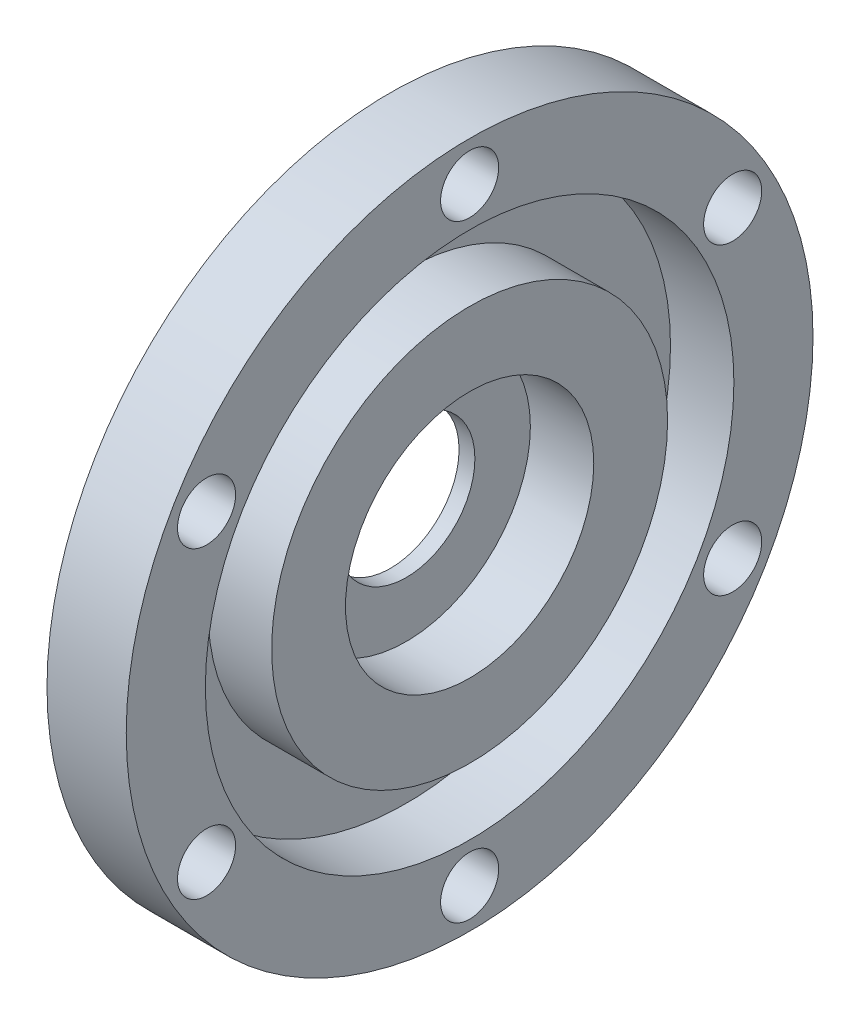
ISO-10303-21;
HEADER;
FILE_DESCRIPTION(('STEP AP214'),'2;1');
FILE_NAME('part.step','',(''),(''),'','','');
FILE_SCHEMA(('AUTOMOTIVE_DESIGN { 1 0 10303 214 1 1 1 1 }'));
ENDSEC;
DATA;
#1=APPLICATION_CONTEXT('core data for automotive mechanical design processes');
#2=APPLICATION_PROTOCOL_DEFINITION('international standard','automotive_design',2000,#1);
#3=PRODUCT_CONTEXT('',#1,'mechanical');
#4=PRODUCT('Part','Part','',(#3));
#5=PRODUCT_RELATED_PRODUCT_CATEGORY('part','',(#4));
#6=PRODUCT_DEFINITION_FORMATION('','',#4);
#7=PRODUCT_DEFINITION_CONTEXT('part definition',#1,'design');
#8=PRODUCT_DEFINITION('design','',#6,#7);
#9=PRODUCT_DEFINITION_SHAPE('','',#8);
#10=(LENGTH_UNIT() NAMED_UNIT(*) SI_UNIT(.MILLI.,.METRE.));
#11=(NAMED_UNIT(*) PLANE_ANGLE_UNIT() SI_UNIT($,.RADIAN.));
#12=(NAMED_UNIT(*) SI_UNIT($,.STERADIAN.) SOLID_ANGLE_UNIT());
#13=UNCERTAINTY_MEASURE_WITH_UNIT(LENGTH_MEASURE(1.E-05),#10,'distance_accuracy_value','');
#14=(GEOMETRIC_REPRESENTATION_CONTEXT(3) GLOBAL_UNCERTAINTY_ASSIGNED_CONTEXT((#13)) GLOBAL_UNIT_ASSIGNED_CONTEXT((#10,
#11,#12)) REPRESENTATION_CONTEXT('',''));
#15=CARTESIAN_POINT('',(0.,0.,0.));
#16=DIRECTION('',(0.,0.,1.));
#17=DIRECTION('',(1.,0.,0.));
#18=AXIS2_PLACEMENT_3D('',#15,#16,#17);
#19=CARTESIAN_POINT('',(3.,57.5,0.));
#20=DIRECTION('',(-1.,0.,0.));
#21=DIRECTION('',(0.,0.,1.));
#22=AXIS2_PLACEMENT_3D('',#19,#20,#21);
#23=CYLINDRICAL_SURFACE('',#22,2.5);
#24=CARTESIAN_POINT('',(0.,57.5,0.));
#25=DIRECTION('',(1.,0.,0.));
#26=DIRECTION('',(0.,0.,-1.));
#27=AXIS2_PLACEMENT_3D('',#24,#25,#26);
#28=CIRCLE('',#27,2.5);
#29=CARTESIAN_POINT('',(0.,57.5,-2.5));
#30=VERTEX_POINT('',#29);
#31=EDGE_CURVE('E87',#30,#30,#28,.T.);
#32=ORIENTED_EDGE('',*,*,#31,.F.);
#33=EDGE_LOOP('',(#32));
#34=FACE_BOUND('',#33,.T.);
#35=CARTESIAN_POINT('',(7.,57.5,0.));
#36=DIRECTION('',(1.,0.,0.));
#37=DIRECTION('',(0.,0.,-1.));
#38=AXIS2_PLACEMENT_3D('',#35,#36,#37);
#39=CIRCLE('',#38,2.5);
#40=CARTESIAN_POINT('',(7.,57.5,-2.5));
#41=VERTEX_POINT('',#40);
#42=EDGE_CURVE('E45',#41,#41,#39,.T.);
#43=ORIENTED_EDGE('',*,*,#42,.T.);
#44=EDGE_LOOP('',(#43));
#45=FACE_BOUND('',#44,.T.);
#46=ADVANCED_FACE('F41',(#34,#45),#23,.F.);
#47=CARTESIAN_POINT('',(3.,28.75,-49.7964607176052));
#48=DIRECTION('',(-1.,0.,0.));
#49=DIRECTION('',(0.,0.,1.));
#50=AXIS2_PLACEMENT_3D('',#47,#48,#49);
#51=CYLINDRICAL_SURFACE('',#50,2.50000000000001);
#52=CARTESIAN_POINT('',(0.,28.75,-49.7964607176052));
#53=DIRECTION('',(1.,0.,0.));
#54=DIRECTION('',(0.,0.,-1.));
#55=AXIS2_PLACEMENT_3D('',#52,#53,#54);
#56=CIRCLE('',#55,2.50000000000001);
#57=CARTESIAN_POINT('',(0.,28.75,-52.2964607176052));
#58=VERTEX_POINT('',#57);
#59=EDGE_CURVE('E84',#58,#58,#56,.T.);
#60=ORIENTED_EDGE('',*,*,#59,.F.);
#61=EDGE_LOOP('',(#60));
#62=FACE_BOUND('',#61,.T.);
#63=CARTESIAN_POINT('',(7.,28.75,-49.7964607176052));
#64=DIRECTION('',(1.,0.,0.));
#65=DIRECTION('',(0.,0.,-1.));
#66=AXIS2_PLACEMENT_3D('',#63,#64,#65);
#67=CIRCLE('',#66,2.50000000000001);
#68=CARTESIAN_POINT('',(7.,28.75,-52.2964607176052));
#69=VERTEX_POINT('',#68);
#70=EDGE_CURVE('E107',#69,#69,#67,.T.);
#71=ORIENTED_EDGE('',*,*,#70,.T.);
#72=EDGE_LOOP('',(#71));
#73=FACE_BOUND('',#72,.T.);
#74=ADVANCED_FACE('F201',(#62,#73),#51,.F.);
#75=CARTESIAN_POINT('',(3.,-28.75,-49.7964607176052));
#76=DIRECTION('',(-1.,0.,0.));
#77=DIRECTION('',(0.,0.,1.));
#78=AXIS2_PLACEMENT_3D('',#75,#76,#77);
#79=CYLINDRICAL_SURFACE('',#78,2.5);
#80=CARTESIAN_POINT('',(0.,-28.75,-49.7964607176052));
#81=DIRECTION('',(1.,0.,0.));
#82=DIRECTION('',(0.,0.,-1.));
#83=AXIS2_PLACEMENT_3D('',#80,#81,#82);
#84=CIRCLE('',#83,2.5);
#85=CARTESIAN_POINT('',(0.,-28.75,-52.2964607176052));
#86=VERTEX_POINT('',#85);
#87=EDGE_CURVE('E81',#86,#86,#84,.T.);
#88=ORIENTED_EDGE('',*,*,#87,.F.);
#89=EDGE_LOOP('',(#88));
#90=FACE_BOUND('',#89,.T.);
#91=CARTESIAN_POINT('',(7.,-28.75,-49.7964607176052));
#92=DIRECTION('',(1.,0.,0.));
#93=DIRECTION('',(0.,0.,-1.));
#94=AXIS2_PLACEMENT_3D('',#91,#92,#93);
#95=CIRCLE('',#94,2.5);
#96=CARTESIAN_POINT('',(7.,-28.75,-52.2964607176052));
#97=VERTEX_POINT('',#96);
#98=EDGE_CURVE('E105',#97,#97,#95,.T.);
#99=ORIENTED_EDGE('',*,*,#98,.T.);
#100=EDGE_LOOP('',(#99));
#101=FACE_BOUND('',#100,.T.);
#102=ADVANCED_FACE('F206',(#90,#101),#79,.F.);
#103=CARTESIAN_POINT('',(3.,-57.5,0.));
#104=DIRECTION('',(-1.,0.,0.));
#105=DIRECTION('',(0.,0.,1.));
#106=AXIS2_PLACEMENT_3D('',#103,#104,#105);
#107=CYLINDRICAL_SURFACE('',#106,2.5);
#108=CARTESIAN_POINT('',(0.,-57.5,0.));
#109=DIRECTION('',(1.,0.,0.));
#110=DIRECTION('',(0.,0.,-1.));
#111=AXIS2_PLACEMENT_3D('',#108,#109,#110);
#112=CIRCLE('',#111,2.5);
#113=CARTESIAN_POINT('',(0.,-57.5,-2.50000000000001));
#114=VERTEX_POINT('',#113);
#115=EDGE_CURVE('E78',#114,#114,#112,.T.);
#116=ORIENTED_EDGE('',*,*,#115,.F.);
#117=EDGE_LOOP('',(#116));
#118=FACE_BOUND('',#117,.T.);
#119=CARTESIAN_POINT('',(7.,-57.5,0.));
#120=DIRECTION('',(1.,0.,0.));
#121=DIRECTION('',(0.,0.,-1.));
#122=AXIS2_PLACEMENT_3D('',#119,#120,#121);
#123=CIRCLE('',#122,2.5);
#124=CARTESIAN_POINT('',(7.,-57.5,-2.50000000000001));
#125=VERTEX_POINT('',#124);
#126=EDGE_CURVE('E102',#125,#125,#123,.T.);
#127=ORIENTED_EDGE('',*,*,#126,.T.);
#128=EDGE_LOOP('',(#127));
#129=FACE_BOUND('',#128,.T.);
#130=ADVANCED_FACE('F213',(#118,#129),#107,.F.);
#131=CARTESIAN_POINT('',(3.,-28.75,49.7964607176052));
#132=DIRECTION('',(-1.,0.,0.));
#133=DIRECTION('',(0.,0.,1.));
#134=AXIS2_PLACEMENT_3D('',#131,#132,#133);
#135=CYLINDRICAL_SURFACE('',#134,2.5);
#136=CARTESIAN_POINT('',(0.,-28.75,49.7964607176052));
#137=DIRECTION('',(1.,0.,0.));
#138=DIRECTION('',(0.,0.,-1.));
#139=AXIS2_PLACEMENT_3D('',#136,#137,#138);
#140=CIRCLE('',#139,2.5);
#141=CARTESIAN_POINT('',(0.,-28.75,47.2964607176052));
#142=VERTEX_POINT('',#141);
#143=EDGE_CURVE('E75',#142,#142,#140,.T.);
#144=ORIENTED_EDGE('',*,*,#143,.F.);
#145=EDGE_LOOP('',(#144));
#146=FACE_BOUND('',#145,.T.);
#147=CARTESIAN_POINT('',(7.,-28.75,49.7964607176052));
#148=DIRECTION('',(1.,0.,0.));
#149=DIRECTION('',(0.,0.,-1.));
#150=AXIS2_PLACEMENT_3D('',#147,#148,#149);
#151=CIRCLE('',#150,2.5);
#152=CARTESIAN_POINT('',(7.,-28.75,47.2964607176052));
#153=VERTEX_POINT('',#152);
#154=EDGE_CURVE('E98',#153,#153,#151,.T.);
#155=ORIENTED_EDGE('',*,*,#154,.T.);
#156=EDGE_LOOP('',(#155));
#157=FACE_BOUND('',#156,.T.);
#158=ADVANCED_FACE('F216',(#146,#157),#135,.F.);
#159=CARTESIAN_POINT('',(3.,28.75,49.7964607176052));
#160=DIRECTION('',(-1.,0.,0.));
#161=DIRECTION('',(0.,0.,1.));
#162=AXIS2_PLACEMENT_3D('',#159,#160,#161);
#163=CYLINDRICAL_SURFACE('',#162,2.50000000000001);
#164=CARTESIAN_POINT('',(0.,28.75,49.7964607176052));
#165=DIRECTION('',(1.,0.,0.));
#166=DIRECTION('',(0.,0.,-1.));
#167=AXIS2_PLACEMENT_3D('',#164,#165,#166);
#168=CIRCLE('',#167,2.50000000000001);
#169=CARTESIAN_POINT('',(0.,28.75,47.2964607176052));
#170=VERTEX_POINT('',#169);
#171=EDGE_CURVE('E68',#170,#170,#168,.T.);
#172=ORIENTED_EDGE('',*,*,#171,.F.);
#173=EDGE_LOOP('',(#172));
#174=FACE_BOUND('',#173,.T.);
#175=CARTESIAN_POINT('',(7.,28.75,49.7964607176052));
#176=DIRECTION('',(1.,0.,0.));
#177=DIRECTION('',(0.,0.,-1.));
#178=AXIS2_PLACEMENT_3D('',#175,#176,#177);
#179=CIRCLE('',#178,2.50000000000001);
#180=CARTESIAN_POINT('',(7.,28.75,47.2964607176052));
#181=VERTEX_POINT('',#180);
#182=EDGE_CURVE('E95',#181,#181,#179,.T.);
#183=ORIENTED_EDGE('',*,*,#182,.T.);
#184=EDGE_LOOP('',(#183));
#185=FACE_BOUND('',#184,.T.);
#186=ADVANCED_FACE('F43',(#174,#185),#163,.F.);
#187=CARTESIAN_POINT('',(3.,0.,0.));
#188=DIRECTION('',(1.,0.,0.));
#189=DIRECTION('',(0.,0.,-1.));
#190=AXIS2_PLACEMENT_3D('',#187,#188,#189);
#191=PLANE('',#190);
#192=CARTESIAN_POINT('',(3.,0.,0.));
#193=DIRECTION('',(1.,0.,0.));
#194=DIRECTION('',(0.,0.,-1.));
#195=AXIS2_PLACEMENT_3D('',#192,#193,#194);
#196=CIRCLE('',#195,13.);
#197=CARTESIAN_POINT('',(3.,0.,-13.));
#198=VERTEX_POINT('',#197);
#199=EDGE_CURVE('E54',#198,#198,#196,.T.);
#200=ORIENTED_EDGE('',*,*,#199,.F.);
#201=EDGE_LOOP('',(#200));
#202=FACE_BOUND('',#201,.T.);
#203=CARTESIAN_POINT('',(3.,0.,0.));
#204=DIRECTION('',(1.,0.,0.));
#205=DIRECTION('',(0.,0.,-1.));
#206=AXIS2_PLACEMENT_3D('',#203,#204,#205);
#207=CIRCLE('',#206,23.5);
#208=CARTESIAN_POINT('',(3.,0.,-23.5));
#209=VERTEX_POINT('',#208);
#210=EDGE_CURVE('E49',#209,#209,#207,.F.);
#211=ORIENTED_EDGE('',*,*,#210,.F.);
#212=EDGE_LOOP('',(#211));
#213=FACE_BOUND('',#212,.T.);
#214=ADVANCED_FACE('F187',(#202,#213),#191,.T.);
#215=CARTESIAN_POINT('',(3.,0.,0.));
#216=DIRECTION('',(-1.,0.,0.));
#217=DIRECTION('',(0.,0.,1.));
#218=AXIS2_PLACEMENT_3D('',#215,#216,#217);
#219=CYLINDRICAL_SURFACE('',#218,65.);
#220=CARTESIAN_POINT('',(0.,0.,0.));
#221=DIRECTION('',(1.,0.,0.));
#222=DIRECTION('',(0.,0.,-1.));
#223=AXIS2_PLACEMENT_3D('',#220,#221,#222);
#224=CIRCLE('',#223,65.);
#225=CARTESIAN_POINT('',(0.,0.,-65.));
#226=VERTEX_POINT('',#225);
#227=EDGE_CURVE('E90',#226,#226,#224,.T.);
#228=ORIENTED_EDGE('',*,*,#227,.T.);
#229=EDGE_LOOP('',(#228));
#230=FACE_BOUND('',#229,.T.);
#231=CARTESIAN_POINT('',(15.,0.,0.));
#232=DIRECTION('',(1.,0.,0.));
#233=DIRECTION('',(0.,0.,-1.));
#234=AXIS2_PLACEMENT_3D('',#231,#232,#233);
#235=CIRCLE('',#234,65.);
#236=CARTESIAN_POINT('',(15.,0.,-65.));
#237=VERTEX_POINT('',#236);
#238=EDGE_CURVE('E58',#237,#237,#235,.T.);
#239=ORIENTED_EDGE('',*,*,#238,.F.);
#240=EDGE_LOOP('',(#239));
#241=FACE_BOUND('',#240,.T.);
#242=ADVANCED_FACE('F184',(#230,#241),#219,.T.);
#243=CARTESIAN_POINT('',(3.,0.,0.));
#244=DIRECTION('',(-1.,0.,0.));
#245=DIRECTION('',(0.,0.,1.));
#246=AXIS2_PLACEMENT_3D('',#243,#244,#245);
#247=CYLINDRICAL_SURFACE('',#246,13.);
#248=ORIENTED_EDGE('',*,*,#199,.T.);
#249=EDGE_LOOP('',(#248));
#250=FACE_BOUND('',#249,.T.);
#251=CARTESIAN_POINT('',(0.,0.,0.));
#252=DIRECTION('',(1.,0.,0.));
#253=DIRECTION('',(0.,0.,-1.));
#254=AXIS2_PLACEMENT_3D('',#251,#252,#253);
#255=CIRCLE('',#254,13.);
#256=CARTESIAN_POINT('',(0.,0.,-13.));
#257=VERTEX_POINT('',#256);
#258=EDGE_CURVE('E72',#257,#257,#255,.T.);
#259=ORIENTED_EDGE('',*,*,#258,.F.);
#260=EDGE_LOOP('',(#259));
#261=FACE_BOUND('',#260,.T.);
#262=ADVANCED_FACE('F186',(#250,#261),#247,.F.);
#263=CARTESIAN_POINT('',(3.,0.,0.));
#264=DIRECTION('',(1.,0.,0.));
#265=DIRECTION('',(0.,0.,-1.));
#266=AXIS2_PLACEMENT_3D('',#263,#264,#265);
#267=CIRCLE('',#266,50.025);
#268=CARTESIAN_POINT('',(3.,0.,-50.025));
#269=VERTEX_POINT('',#268);
#270=EDGE_CURVE('E11',#269,#269,#267,.F.);
#271=ORIENTED_EDGE('',*,*,#270,.F.);
#272=EDGE_LOOP('',(#271));
#273=FACE_BOUND('',#272,.T.);
#274=CARTESIAN_POINT('',(3.,0.,0.));
#275=DIRECTION('',(1.,0.,0.));
#276=DIRECTION('',(0.,0.,-1.));
#277=AXIS2_PLACEMENT_3D('',#274,#275,#276);
#278=CIRCLE('',#277,37.475);
#279=CARTESIAN_POINT('',(3.,0.,-37.475));
#280=VERTEX_POINT('',#279);
#281=EDGE_CURVE('E66',#280,#280,#278,.F.);
#282=ORIENTED_EDGE('',*,*,#281,.T.);
#283=EDGE_LOOP('',(#282));
#284=FACE_BOUND('',#283,.T.);
#285=ADVANCED_FACE('F194',(#273,#284),#191,.T.);
#286=CARTESIAN_POINT('',(0.,0.,0.));
#287=DIRECTION('',(1.,0.,0.));
#288=DIRECTION('',(0.,0.,-1.));
#289=AXIS2_PLACEMENT_3D('',#286,#287,#288);
#290=PLANE('',#289);
#291=ORIENTED_EDGE('',*,*,#258,.T.);
#292=EDGE_LOOP('',(#291));
#293=FACE_BOUND('',#292,.T.);
#294=ORIENTED_EDGE('',*,*,#227,.F.);
#295=EDGE_LOOP('',(#294));
#296=FACE_BOUND('',#295,.T.);
#297=ORIENTED_EDGE('',*,*,#31,.T.);
#298=EDGE_LOOP('',(#297));
#299=FACE_BOUND('',#298,.T.);
#300=ORIENTED_EDGE('',*,*,#59,.T.);
#301=EDGE_LOOP('',(#300));
#302=FACE_BOUND('',#301,.T.);
#303=ORIENTED_EDGE('',*,*,#87,.T.);
#304=EDGE_LOOP('',(#303));
#305=FACE_BOUND('',#304,.T.);
#306=ORIENTED_EDGE('',*,*,#115,.T.);
#307=EDGE_LOOP('',(#306));
#308=FACE_BOUND('',#307,.T.);
#309=ORIENTED_EDGE('',*,*,#143,.T.);
#310=EDGE_LOOP('',(#309));
#311=FACE_BOUND('',#310,.T.);
#312=ORIENTED_EDGE('',*,*,#171,.T.);
#313=EDGE_LOOP('',(#312));
#314=FACE_BOUND('',#313,.T.);
#315=ADVANCED_FACE('F260',(#293,#296,#299,#302,#305,#308,#311,#314),#290,.F.);
#316=CARTESIAN_POINT('',(15.,0.,0.));
#317=DIRECTION('',(-1.,0.,0.));
#318=DIRECTION('',(0.,0.,1.));
#319=AXIS2_PLACEMENT_3D('',#316,#317,#318);
#320=CYLINDRICAL_SURFACE('',#319,23.5);
#321=ORIENTED_EDGE('',*,*,#210,.T.);
#322=EDGE_LOOP('',(#321));
#323=FACE_BOUND('',#322,.T.);
#324=CARTESIAN_POINT('',(15.,0.,0.));
#325=DIRECTION('',(1.,0.,0.));
#326=DIRECTION('',(0.,0.,-1.));
#327=AXIS2_PLACEMENT_3D('',#324,#325,#326);
#328=CIRCLE('',#327,23.5);
#329=CARTESIAN_POINT('',(15.,0.,-23.5));
#330=VERTEX_POINT('',#329);
#331=EDGE_CURVE('E60',#330,#330,#328,.T.);
#332=ORIENTED_EDGE('',*,*,#331,.T.);
#333=EDGE_LOOP('',(#332));
#334=FACE_BOUND('',#333,.T.);
#335=ADVANCED_FACE('F257',(#323,#334),#320,.F.);
#336=CARTESIAN_POINT('',(15.,0.,0.));
#337=DIRECTION('',(-1.,0.,0.));
#338=DIRECTION('',(0.,0.,1.));
#339=AXIS2_PLACEMENT_3D('',#336,#337,#338);
#340=CYLINDRICAL_SURFACE('',#339,37.475);
#341=ORIENTED_EDGE('',*,*,#281,.F.);
#342=EDGE_LOOP('',(#341));
#343=FACE_BOUND('',#342,.T.);
#344=CARTESIAN_POINT('',(15.,0.,0.));
#345=DIRECTION('',(1.,0.,0.));
#346=DIRECTION('',(0.,0.,-1.));
#347=AXIS2_PLACEMENT_3D('',#344,#345,#346);
#348=CIRCLE('',#347,37.475);
#349=CARTESIAN_POINT('',(15.,0.,-37.475));
#350=VERTEX_POINT('',#349);
#351=EDGE_CURVE('E63',#350,#350,#348,.T.);
#352=ORIENTED_EDGE('',*,*,#351,.F.);
#353=EDGE_LOOP('',(#352));
#354=FACE_BOUND('',#353,.T.);
#355=ADVANCED_FACE('F253',(#343,#354),#340,.T.);
#356=CARTESIAN_POINT('',(15.,0.,0.));
#357=DIRECTION('',(1.,0.,0.));
#358=DIRECTION('',(0.,0.,-1.));
#359=AXIS2_PLACEMENT_3D('',#356,#357,#358);
#360=PLANE('',#359);
#361=ORIENTED_EDGE('',*,*,#331,.F.);
#362=EDGE_LOOP('',(#361));
#363=FACE_BOUND('',#362,.T.);
#364=ORIENTED_EDGE('',*,*,#351,.T.);
#365=EDGE_LOOP('',(#364));
#366=FACE_BOUND('',#365,.T.);
#367=ADVANCED_FACE('F250',(#363,#366),#360,.T.);
#368=CARTESIAN_POINT('',(15.,0.,0.));
#369=DIRECTION('',(-1.,0.,0.));
#370=DIRECTION('',(0.,0.,1.));
#371=AXIS2_PLACEMENT_3D('',#368,#369,#370);
#372=CYLINDRICAL_SURFACE('',#371,50.025);
#373=ORIENTED_EDGE('',*,*,#270,.T.);
#374=EDGE_LOOP('',(#373));
#375=FACE_BOUND('',#374,.T.);
#376=CARTESIAN_POINT('',(15.,0.,0.));
#377=DIRECTION('',(1.,0.,0.));
#378=DIRECTION('',(0.,0.,-1.));
#379=AXIS2_PLACEMENT_3D('',#376,#377,#378);
#380=CIRCLE('',#379,50.025);
#381=CARTESIAN_POINT('',(15.,0.,-50.025));
#382=VERTEX_POINT('',#381);
#383=EDGE_CURVE('E112',#382,#382,#380,.T.);
#384=ORIENTED_EDGE('',*,*,#383,.T.);
#385=EDGE_LOOP('',(#384));
#386=FACE_BOUND('',#385,.T.);
#387=ADVANCED_FACE('F169',(#375,#386),#372,.F.);
#388=CARTESIAN_POINT('',(15.,0.,0.));
#389=DIRECTION('',(1.,0.,0.));
#390=DIRECTION('',(0.,0.,-1.));
#391=AXIS2_PLACEMENT_3D('',#388,#389,#390);
#392=PLANE('',#391);
#393=CARTESIAN_POINT('',(15.,57.5,0.));
#394=DIRECTION('',(1.,0.,0.));
#395=DIRECTION('',(0.,0.,-1.));
#396=AXIS2_PLACEMENT_3D('',#393,#394,#395);
#397=CIRCLE('',#396,5.5);
#398=CARTESIAN_POINT('',(15.,57.5,-5.5));
#399=VERTEX_POINT('',#398);
#400=EDGE_CURVE('E145',#399,#399,#397,.T.);
#401=ORIENTED_EDGE('',*,*,#400,.F.);
#402=EDGE_LOOP('',(#401));
#403=FACE_BOUND('',#402,.T.);
#404=CARTESIAN_POINT('',(15.,28.75,49.7964607176052));
#405=DIRECTION('',(1.,0.,0.));
#406=DIRECTION('',(0.,0.,-1.));
#407=AXIS2_PLACEMENT_3D('',#404,#405,#406);
#408=CIRCLE('',#407,5.5);
#409=CARTESIAN_POINT('',(15.,28.75,44.2964607176052));
#410=VERTEX_POINT('',#409);
#411=EDGE_CURVE('E146',#410,#410,#408,.T.);
#412=ORIENTED_EDGE('',*,*,#411,.F.);
#413=EDGE_LOOP('',(#412));
#414=FACE_BOUND('',#413,.T.);
#415=CARTESIAN_POINT('',(15.,-28.75,49.7964607176052));
#416=DIRECTION('',(1.,0.,0.));
#417=DIRECTION('',(0.,0.,-1.));
#418=AXIS2_PLACEMENT_3D('',#415,#416,#417);
#419=CIRCLE('',#418,5.5);
#420=CARTESIAN_POINT('',(15.,-28.75,44.2964607176052));
#421=VERTEX_POINT('',#420);
#422=EDGE_CURVE('E120',#421,#421,#419,.T.);
#423=ORIENTED_EDGE('',*,*,#422,.F.);
#424=EDGE_LOOP('',(#423));
#425=FACE_BOUND('',#424,.T.);
#426=CARTESIAN_POINT('',(15.,-57.5,0.));
#427=DIRECTION('',(1.,0.,0.));
#428=DIRECTION('',(0.,0.,-1.));
#429=AXIS2_PLACEMENT_3D('',#426,#427,#428);
#430=CIRCLE('',#429,5.5);
#431=CARTESIAN_POINT('',(15.,-57.5,-5.50000000000001));
#432=VERTEX_POINT('',#431);
#433=EDGE_CURVE('E127',#432,#432,#430,.T.);
#434=ORIENTED_EDGE('',*,*,#433,.F.);
#435=EDGE_LOOP('',(#434));
#436=FACE_BOUND('',#435,.T.);
#437=CARTESIAN_POINT('',(15.,-28.75,-49.7964607176052));
#438=DIRECTION('',(1.,0.,0.));
#439=DIRECTION('',(0.,0.,-1.));
#440=AXIS2_PLACEMENT_3D('',#437,#438,#439);
#441=CIRCLE('',#440,5.5);
#442=CARTESIAN_POINT('',(15.,-28.75,-55.2964607176052));
#443=VERTEX_POINT('',#442);
#444=EDGE_CURVE('E133',#443,#443,#441,.T.);
#445=ORIENTED_EDGE('',*,*,#444,.F.);
#446=EDGE_LOOP('',(#445));
#447=FACE_BOUND('',#446,.T.);
#448=CARTESIAN_POINT('',(15.,28.75,-49.7964607176052));
#449=DIRECTION('',(1.,0.,0.));
#450=DIRECTION('',(0.,0.,-1.));
#451=AXIS2_PLACEMENT_3D('',#448,#449,#450);
#452=CIRCLE('',#451,5.5);
#453=CARTESIAN_POINT('',(15.,28.75,-55.2964607176052));
#454=VERTEX_POINT('',#453);
#455=EDGE_CURVE('E139',#454,#454,#452,.T.);
#456=ORIENTED_EDGE('',*,*,#455,.F.);
#457=EDGE_LOOP('',(#456));
#458=FACE_BOUND('',#457,.T.);
#459=ORIENTED_EDGE('',*,*,#383,.F.);
#460=EDGE_LOOP('',(#459));
#461=FACE_BOUND('',#460,.T.);
#462=ORIENTED_EDGE('',*,*,#238,.T.);
#463=EDGE_LOOP('',(#462));
#464=FACE_BOUND('',#463,.T.);
#465=ADVANCED_FACE('F165',(#403,#414,#425,#436,#447,#458,#461,#464),#392,.T.);
#466=CARTESIAN_POINT('',(7.,28.75,-49.7964607176052));
#467=DIRECTION('',(1.,0.,0.));
#468=DIRECTION('',(0.,0.,-1.));
#469=AXIS2_PLACEMENT_3D('',#466,#467,#468);
#470=CYLINDRICAL_SURFACE('',#469,5.5);
#471=CARTESIAN_POINT('',(7.,28.75,-49.7964607176052));
#472=DIRECTION('',(1.,0.,0.));
#473=DIRECTION('',(0.,0.,-1.));
#474=AXIS2_PLACEMENT_3D('',#471,#472,#473);
#475=CIRCLE('',#474,5.5);
#476=CARTESIAN_POINT('',(7.,28.75,-55.2964607176052));
#477=VERTEX_POINT('',#476);
#478=EDGE_CURVE('E142',#477,#477,#475,.T.);
#479=ORIENTED_EDGE('',*,*,#478,.F.);
#480=EDGE_LOOP('',(#479));
#481=FACE_BOUND('',#480,.T.);
#482=ORIENTED_EDGE('',*,*,#455,.T.);
#483=EDGE_LOOP('',(#482));
#484=FACE_BOUND('',#483,.T.);
#485=ADVANCED_FACE('F168',(#481,#484),#470,.F.);
#486=CARTESIAN_POINT('',(7.,28.75,-49.7964607176052));
#487=DIRECTION('',(1.,0.,0.));
#488=DIRECTION('',(0.,0.,-1.));
#489=AXIS2_PLACEMENT_3D('',#486,#487,#488);
#490=PLANE('',#489);
#491=ORIENTED_EDGE('',*,*,#70,.F.);
#492=EDGE_LOOP('',(#491));
#493=FACE_BOUND('',#492,.T.);
#494=ORIENTED_EDGE('',*,*,#478,.T.);
#495=EDGE_LOOP('',(#494));
#496=FACE_BOUND('',#495,.T.);
#497=ADVANCED_FACE('F296',(#493,#496),#490,.T.);
#498=CARTESIAN_POINT('',(7.,-28.75,-49.7964607176052));
#499=DIRECTION('',(1.,0.,0.));
#500=DIRECTION('',(0.,0.,-1.));
#501=AXIS2_PLACEMENT_3D('',#498,#499,#500);
#502=CYLINDRICAL_SURFACE('',#501,5.5);
#503=CARTESIAN_POINT('',(7.,-28.75,-49.7964607176052));
#504=DIRECTION('',(1.,0.,0.));
#505=DIRECTION('',(0.,0.,-1.));
#506=AXIS2_PLACEMENT_3D('',#503,#504,#505);
#507=CIRCLE('',#506,5.5);
#508=CARTESIAN_POINT('',(7.,-28.75,-55.2964607176052));
#509=VERTEX_POINT('',#508);
#510=EDGE_CURVE('E136',#509,#509,#507,.T.);
#511=ORIENTED_EDGE('',*,*,#510,.F.);
#512=EDGE_LOOP('',(#511));
#513=FACE_BOUND('',#512,.T.);
#514=ORIENTED_EDGE('',*,*,#444,.T.);
#515=EDGE_LOOP('',(#514));
#516=FACE_BOUND('',#515,.T.);
#517=ADVANCED_FACE('F299',(#513,#516),#502,.F.);
#518=CARTESIAN_POINT('',(7.,-28.75,-49.7964607176052));
#519=DIRECTION('',(1.,0.,0.));
#520=DIRECTION('',(0.,0.,-1.));
#521=AXIS2_PLACEMENT_3D('',#518,#519,#520);
#522=PLANE('',#521);
#523=ORIENTED_EDGE('',*,*,#98,.F.);
#524=EDGE_LOOP('',(#523));
#525=FACE_BOUND('',#524,.T.);
#526=ORIENTED_EDGE('',*,*,#510,.T.);
#527=EDGE_LOOP('',(#526));
#528=FACE_BOUND('',#527,.T.);
#529=ADVANCED_FACE('F304',(#525,#528),#522,.T.);
#530=CARTESIAN_POINT('',(7.,-57.5,0.));
#531=DIRECTION('',(1.,0.,0.));
#532=DIRECTION('',(0.,0.,-1.));
#533=AXIS2_PLACEMENT_3D('',#530,#531,#532);
#534=CYLINDRICAL_SURFACE('',#533,5.5);
#535=CARTESIAN_POINT('',(7.,-57.5,0.));
#536=DIRECTION('',(1.,0.,0.));
#537=DIRECTION('',(0.,0.,-1.));
#538=AXIS2_PLACEMENT_3D('',#535,#536,#537);
#539=CIRCLE('',#538,5.5);
#540=CARTESIAN_POINT('',(7.,-57.5,-5.50000000000001));
#541=VERTEX_POINT('',#540);
#542=EDGE_CURVE('E130',#541,#541,#539,.T.);
#543=ORIENTED_EDGE('',*,*,#542,.F.);
#544=EDGE_LOOP('',(#543));
#545=FACE_BOUND('',#544,.T.);
#546=ORIENTED_EDGE('',*,*,#433,.T.);
#547=EDGE_LOOP('',(#546));
#548=FACE_BOUND('',#547,.T.);
#549=ADVANCED_FACE('F243',(#545,#548),#534,.F.);
#550=CARTESIAN_POINT('',(7.,-57.5,0.));
#551=DIRECTION('',(1.,0.,0.));
#552=DIRECTION('',(0.,0.,-1.));
#553=AXIS2_PLACEMENT_3D('',#550,#551,#552);
#554=PLANE('',#553);
#555=ORIENTED_EDGE('',*,*,#126,.F.);
#556=EDGE_LOOP('',(#555));
#557=FACE_BOUND('',#556,.T.);
#558=ORIENTED_EDGE('',*,*,#542,.T.);
#559=EDGE_LOOP('',(#558));
#560=FACE_BOUND('',#559,.T.);
#561=ADVANCED_FACE('F238',(#557,#560),#554,.T.);
#562=CARTESIAN_POINT('',(7.,-28.75,49.7964607176052));
#563=DIRECTION('',(1.,0.,0.));
#564=DIRECTION('',(0.,0.,-1.));
#565=AXIS2_PLACEMENT_3D('',#562,#563,#564);
#566=CYLINDRICAL_SURFACE('',#565,5.5);
#567=CARTESIAN_POINT('',(7.,-28.75,49.7964607176052));
#568=DIRECTION('',(1.,0.,0.));
#569=DIRECTION('',(0.,0.,-1.));
#570=AXIS2_PLACEMENT_3D('',#567,#568,#569);
#571=CIRCLE('',#570,5.5);
#572=CARTESIAN_POINT('',(7.,-28.75,44.2964607176052));
#573=VERTEX_POINT('',#572);
#574=EDGE_CURVE('E123',#573,#573,#571,.T.);
#575=ORIENTED_EDGE('',*,*,#574,.F.);
#576=EDGE_LOOP('',(#575));
#577=FACE_BOUND('',#576,.T.);
#578=ORIENTED_EDGE('',*,*,#422,.T.);
#579=EDGE_LOOP('',(#578));
#580=FACE_BOUND('',#579,.T.);
#581=ADVANCED_FACE('F232',(#577,#580),#566,.F.);
#582=CARTESIAN_POINT('',(7.,-28.75,49.7964607176052));
#583=DIRECTION('',(1.,0.,0.));
#584=DIRECTION('',(0.,0.,-1.));
#585=AXIS2_PLACEMENT_3D('',#582,#583,#584);
#586=PLANE('',#585);
#587=ORIENTED_EDGE('',*,*,#154,.F.);
#588=EDGE_LOOP('',(#587));
#589=FACE_BOUND('',#588,.T.);
#590=ORIENTED_EDGE('',*,*,#574,.T.);
#591=EDGE_LOOP('',(#590));
#592=FACE_BOUND('',#591,.T.);
#593=ADVANCED_FACE('F228',(#589,#592),#586,.T.);
#594=CARTESIAN_POINT('',(7.,28.75,49.7964607176052));
#595=DIRECTION('',(1.,0.,0.));
#596=DIRECTION('',(0.,0.,-1.));
#597=AXIS2_PLACEMENT_3D('',#594,#595,#596);
#598=CYLINDRICAL_SURFACE('',#597,5.5);
#599=CARTESIAN_POINT('',(7.,28.75,49.7964607176052));
#600=DIRECTION('',(1.,0.,0.));
#601=DIRECTION('',(0.,0.,-1.));
#602=AXIS2_PLACEMENT_3D('',#599,#600,#601);
#603=CIRCLE('',#602,5.5);
#604=CARTESIAN_POINT('',(7.,28.75,44.2964607176052));
#605=VERTEX_POINT('',#604);
#606=EDGE_CURVE('E124',#605,#605,#603,.T.);
#607=ORIENTED_EDGE('',*,*,#606,.F.);
#608=EDGE_LOOP('',(#607));
#609=FACE_BOUND('',#608,.T.);
#610=ORIENTED_EDGE('',*,*,#411,.T.);
#611=EDGE_LOOP('',(#610));
#612=FACE_BOUND('',#611,.T.);
#613=ADVANCED_FACE('F231',(#609,#612),#598,.F.);
#614=CARTESIAN_POINT('',(7.,28.75,49.7964607176052));
#615=DIRECTION('',(1.,0.,0.));
#616=DIRECTION('',(0.,0.,-1.));
#617=AXIS2_PLACEMENT_3D('',#614,#615,#616);
#618=PLANE('',#617);
#619=ORIENTED_EDGE('',*,*,#182,.F.);
#620=EDGE_LOOP('',(#619));
#621=FACE_BOUND('',#620,.T.);
#622=ORIENTED_EDGE('',*,*,#606,.T.);
#623=EDGE_LOOP('',(#622));
#624=FACE_BOUND('',#623,.T.);
#625=ADVANCED_FACE('F161',(#621,#624),#618,.T.);
#626=CARTESIAN_POINT('',(7.,57.5,0.));
#627=DIRECTION('',(1.,0.,0.));
#628=DIRECTION('',(0.,0.,-1.));
#629=AXIS2_PLACEMENT_3D('',#626,#627,#628);
#630=CYLINDRICAL_SURFACE('',#629,5.5);
#631=CARTESIAN_POINT('',(7.,57.5,0.));
#632=DIRECTION('',(1.,0.,0.));
#633=DIRECTION('',(0.,0.,-1.));
#634=AXIS2_PLACEMENT_3D('',#631,#632,#633);
#635=CIRCLE('',#634,5.5);
#636=CARTESIAN_POINT('',(7.,57.5,-5.5));
#637=VERTEX_POINT('',#636);
#638=EDGE_CURVE('E99',#637,#637,#635,.T.);
#639=ORIENTED_EDGE('',*,*,#638,.F.);
#640=EDGE_LOOP('',(#639));
#641=FACE_BOUND('',#640,.T.);
#642=ORIENTED_EDGE('',*,*,#400,.T.);
#643=EDGE_LOOP('',(#642));
#644=FACE_BOUND('',#643,.T.);
#645=ADVANCED_FACE('F158',(#641,#644),#630,.F.);
#646=CARTESIAN_POINT('',(7.,57.5,0.));
#647=DIRECTION('',(1.,0.,0.));
#648=DIRECTION('',(0.,0.,-1.));
#649=AXIS2_PLACEMENT_3D('',#646,#647,#648);
#650=PLANE('',#649);
#651=ORIENTED_EDGE('',*,*,#42,.F.);
#652=EDGE_LOOP('',(#651));
#653=FACE_BOUND('',#652,.T.);
#654=ORIENTED_EDGE('',*,*,#638,.T.);
#655=EDGE_LOOP('',(#654));
#656=FACE_BOUND('',#655,.T.);
#657=ADVANCED_FACE('F156',(#653,#656),#650,.T.);
#658=CLOSED_SHELL('',(#46,#74,#102,#130,#158,#186,#214,#242,#262,#285,#315,#335,#355,#367,#387,
#465,#485,#497,#517,#529,#549,#561,#581,#593,#613,#625,#645,#657));
#659=MANIFOLD_SOLID_BREP('B2',#658);
#660=ADVANCED_BREP_SHAPE_REPRESENTATION('',(#18,#659),#14);
#661=SHAPE_DEFINITION_REPRESENTATION(#9,#660);
ENDSEC;
END-ISO-10303-21;
